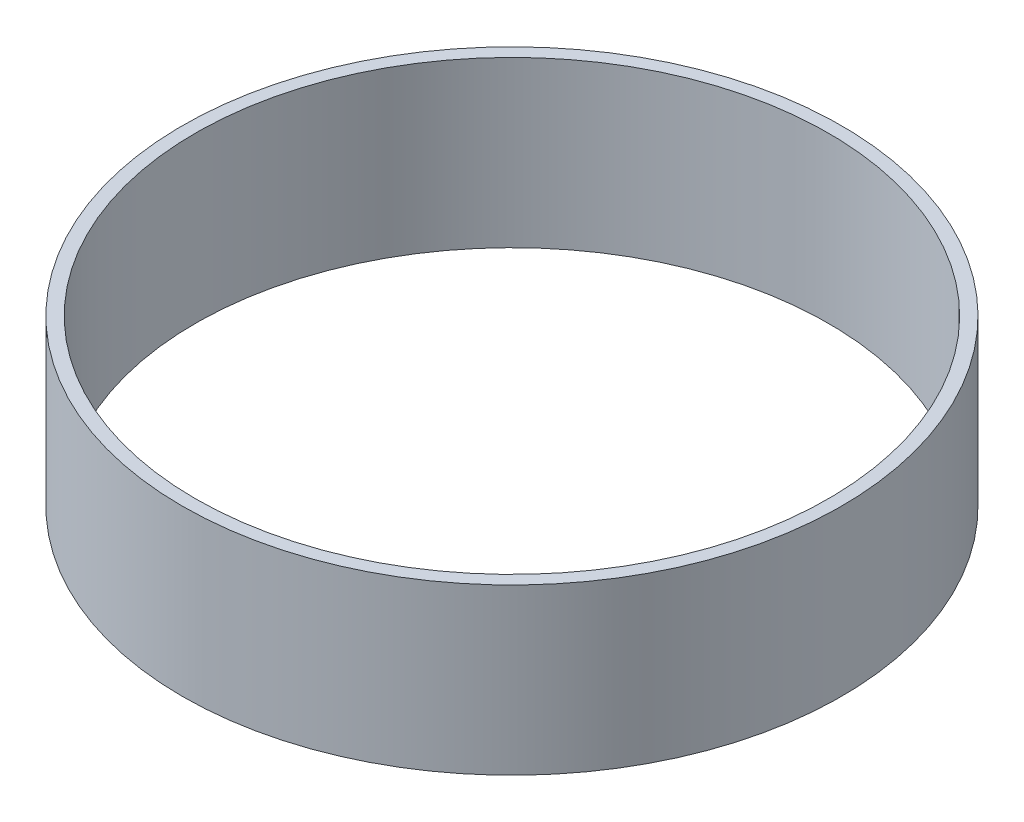
ISO-10303-21;
HEADER;
FILE_DESCRIPTION(('STEP AP214'),'2;1');
FILE_NAME('part.step','',(''),(''),'','','');
FILE_SCHEMA(('AUTOMOTIVE_DESIGN { 1 0 10303 214 1 1 1 1 }'));
ENDSEC;
DATA;
#1=APPLICATION_CONTEXT('core data for automotive mechanical design processes');
#2=APPLICATION_PROTOCOL_DEFINITION('international standard','automotive_design',2000,#1);
#3=PRODUCT_CONTEXT('',#1,'mechanical');
#4=PRODUCT('Part','Part','',(#3));
#5=PRODUCT_RELATED_PRODUCT_CATEGORY('part','',(#4));
#6=PRODUCT_DEFINITION_FORMATION('','',#4);
#7=PRODUCT_DEFINITION_CONTEXT('part definition',#1,'design');
#8=PRODUCT_DEFINITION('design','',#6,#7);
#9=PRODUCT_DEFINITION_SHAPE('','',#8);
#10=(LENGTH_UNIT() NAMED_UNIT(*) SI_UNIT(.MILLI.,.METRE.));
#11=(NAMED_UNIT(*) PLANE_ANGLE_UNIT() SI_UNIT($,.RADIAN.));
#12=(NAMED_UNIT(*) SI_UNIT($,.STERADIAN.) SOLID_ANGLE_UNIT());
#13=UNCERTAINTY_MEASURE_WITH_UNIT(LENGTH_MEASURE(1.E-05),#10,'distance_accuracy_value','');
#14=(GEOMETRIC_REPRESENTATION_CONTEXT(3) GLOBAL_UNCERTAINTY_ASSIGNED_CONTEXT((#13)) GLOBAL_UNIT_ASSIGNED_CONTEXT((#10,
#11,#12)) REPRESENTATION_CONTEXT('',''));
#15=CARTESIAN_POINT('',(0.,0.,0.));
#16=DIRECTION('',(0.,0.,1.));
#17=DIRECTION('',(1.,0.,0.));
#18=AXIS2_PLACEMENT_3D('',#15,#16,#17);
#19=CARTESIAN_POINT('',(0.,12.7,0.));
#20=DIRECTION('',(0.,1.,0.));
#21=DIRECTION('',(0.,0.,1.));
#22=AXIS2_PLACEMENT_3D('',#19,#20,#21);
#23=PLANE('',#22);
#24=CARTESIAN_POINT('',(0.,12.7,0.));
#25=DIRECTION('',(0.,1.,0.));
#26=DIRECTION('',(0.,0.,1.));
#27=AXIS2_PLACEMENT_3D('',#24,#25,#26);
#28=CIRCLE('',#27,25.4);
#29=CARTESIAN_POINT('',(0.,12.7,25.4));
#30=VERTEX_POINT('',#29);
#31=EDGE_CURVE('E10',#30,#30,#28,.T.);
#32=ORIENTED_EDGE('',*,*,#31,.T.);
#33=EDGE_LOOP('',(#32));
#34=FACE_BOUND('',#33,.T.);
#35=CARTESIAN_POINT('',(0.,12.7,0.));
#36=DIRECTION('',(0.,1.,0.));
#37=DIRECTION('',(0.,0.,1.));
#38=AXIS2_PLACEMENT_3D('',#35,#36,#37);
#39=CIRCLE('',#38,24.4);
#40=CARTESIAN_POINT('',(0.,12.7,24.4));
#41=VERTEX_POINT('',#40);
#42=EDGE_CURVE('E50',#41,#41,#39,.T.);
#43=ORIENTED_EDGE('',*,*,#42,.F.);
#44=EDGE_LOOP('',(#43));
#45=FACE_BOUND('',#44,.T.);
#46=ADVANCED_FACE('F37',(#34,#45),#23,.T.);
#47=CARTESIAN_POINT('',(0.,0.,0.));
#48=DIRECTION('',(0.,1.,0.));
#49=DIRECTION('',(0.,0.,1.));
#50=AXIS2_PLACEMENT_3D('',#47,#48,#49);
#51=PLANE('',#50);
#52=CARTESIAN_POINT('',(0.,0.,0.));
#53=DIRECTION('',(0.,1.,0.));
#54=DIRECTION('',(0.,0.,1.));
#55=AXIS2_PLACEMENT_3D('',#52,#53,#54);
#56=CIRCLE('',#55,25.4);
#57=CARTESIAN_POINT('',(0.,0.,25.4));
#58=VERTEX_POINT('',#57);
#59=EDGE_CURVE('E41',#58,#58,#56,.T.);
#60=ORIENTED_EDGE('',*,*,#59,.F.);
#61=EDGE_LOOP('',(#60));
#62=FACE_BOUND('',#61,.T.);
#63=CARTESIAN_POINT('',(0.,0.,0.));
#64=DIRECTION('',(0.,1.,0.));
#65=DIRECTION('',(0.,0.,1.));
#66=AXIS2_PLACEMENT_3D('',#63,#64,#65);
#67=CIRCLE('',#66,24.4);
#68=CARTESIAN_POINT('',(0.,0.,24.4));
#69=VERTEX_POINT('',#68);
#70=EDGE_CURVE('E52',#69,#69,#67,.T.);
#71=ORIENTED_EDGE('',*,*,#70,.T.);
#72=EDGE_LOOP('',(#71));
#73=FACE_BOUND('',#72,.T.);
#74=ADVANCED_FACE('F64',(#62,#73),#51,.F.);
#75=CARTESIAN_POINT('',(0.,12.7,0.));
#76=DIRECTION('',(0.,-1.,0.));
#77=DIRECTION('',(0.,0.,-1.));
#78=AXIS2_PLACEMENT_3D('',#75,#76,#77);
#79=CYLINDRICAL_SURFACE('',#78,25.4);
#80=ORIENTED_EDGE('',*,*,#31,.F.);
#81=EDGE_LOOP('',(#80));
#82=FACE_BOUND('',#81,.T.);
#83=ORIENTED_EDGE('',*,*,#59,.T.);
#84=EDGE_LOOP('',(#83));
#85=FACE_BOUND('',#84,.T.);
#86=ADVANCED_FACE('F39',(#82,#85),#79,.T.);
#87=CARTESIAN_POINT('',(0.,12.7,0.));
#88=DIRECTION('',(0.,-1.,0.));
#89=DIRECTION('',(0.,0.,-1.));
#90=AXIS2_PLACEMENT_3D('',#87,#88,#89);
#91=CYLINDRICAL_SURFACE('',#90,24.4);
#92=ORIENTED_EDGE('',*,*,#42,.T.);
#93=EDGE_LOOP('',(#92));
#94=FACE_BOUND('',#93,.T.);
#95=ORIENTED_EDGE('',*,*,#70,.F.);
#96=EDGE_LOOP('',(#95));
#97=FACE_BOUND('',#96,.T.);
#98=ADVANCED_FACE('F60',(#94,#97),#91,.F.);
#99=CLOSED_SHELL('',(#46,#74,#86,#98));
#100=MANIFOLD_SOLID_BREP('B2',#99);
#101=ADVANCED_BREP_SHAPE_REPRESENTATION('',(#18,#100),#14);
#102=SHAPE_DEFINITION_REPRESENTATION(#9,#101);
ENDSEC;
END-ISO-10303-21;
